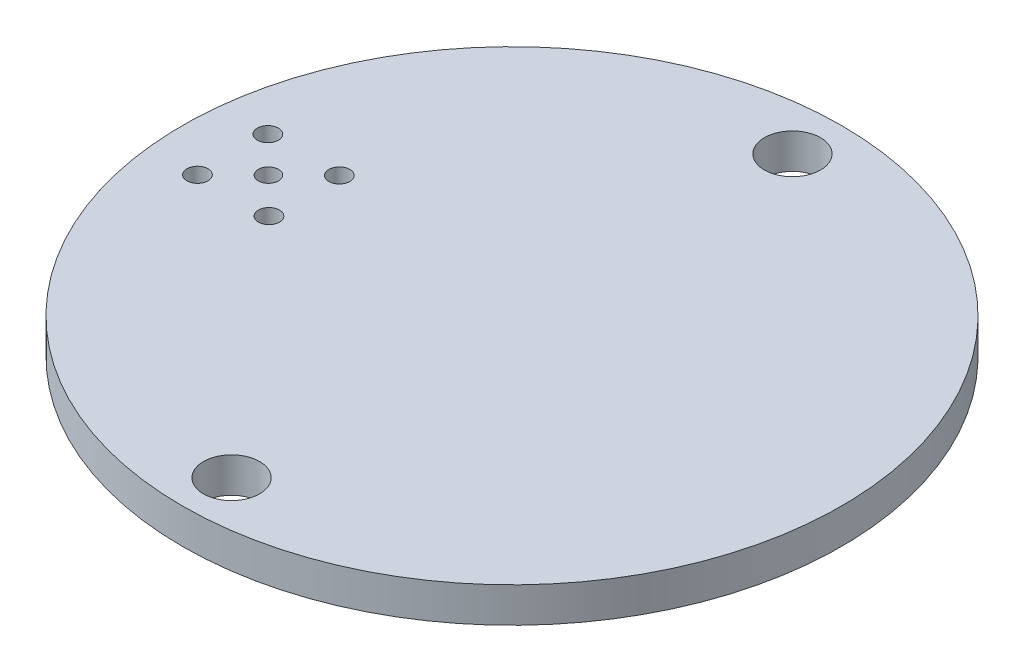
ISO-10303-21;
HEADER;
FILE_DESCRIPTION(('STEP AP214'),'2;1');
FILE_NAME('part.step','',(''),(''),'','','');
FILE_SCHEMA(('AUTOMOTIVE_DESIGN { 1 0 10303 214 1 1 1 1 }'));
ENDSEC;
DATA;
#1=APPLICATION_CONTEXT('core data for automotive mechanical design processes');
#2=APPLICATION_PROTOCOL_DEFINITION('international standard','automotive_design',2000,#1);
#3=PRODUCT_CONTEXT('',#1,'mechanical');
#4=PRODUCT('Part','Part','',(#3));
#5=PRODUCT_RELATED_PRODUCT_CATEGORY('part','',(#4));
#6=PRODUCT_DEFINITION_FORMATION('','',#4);
#7=PRODUCT_DEFINITION_CONTEXT('part definition',#1,'design');
#8=PRODUCT_DEFINITION('design','',#6,#7);
#9=PRODUCT_DEFINITION_SHAPE('','',#8);
#10=(LENGTH_UNIT() NAMED_UNIT(*) SI_UNIT(.MILLI.,.METRE.));
#11=(NAMED_UNIT(*) PLANE_ANGLE_UNIT() SI_UNIT($,.RADIAN.));
#12=(NAMED_UNIT(*) SI_UNIT($,.STERADIAN.) SOLID_ANGLE_UNIT());
#13=UNCERTAINTY_MEASURE_WITH_UNIT(LENGTH_MEASURE(1.E-05),#10,'distance_accuracy_value','');
#14=(GEOMETRIC_REPRESENTATION_CONTEXT(3) GLOBAL_UNCERTAINTY_ASSIGNED_CONTEXT((#13)) GLOBAL_UNIT_ASSIGNED_CONTEXT((#10,
#11,#12)) REPRESENTATION_CONTEXT('',''));
#15=CARTESIAN_POINT('',(0.,0.,0.));
#16=DIRECTION('',(0.,0.,1.));
#17=DIRECTION('',(1.,0.,0.));
#18=AXIS2_PLACEMENT_3D('',#15,#16,#17);
#19=CARTESIAN_POINT('',(0.,2.5,0.));
#20=DIRECTION('',(0.,1.,0.));
#21=DIRECTION('',(0.,0.,1.));
#22=AXIS2_PLACEMENT_3D('',#19,#20,#21);
#23=PLANE('',#22);
#24=CARTESIAN_POINT('',(-19.9202152137773,2.5,2.51));
#25=DIRECTION('',(0.,1.,0.));
#26=DIRECTION('',(0.,0.,-1.));
#27=AXIS2_PLACEMENT_3D('',#24,#25,#26);
#28=CIRCLE('',#27,0.750000000000002);
#29=CARTESIAN_POINT('',(-19.9202152137773,2.5,1.76));
#30=VERTEX_POINT('',#29);
#31=EDGE_CURVE('E75',#30,#30,#28,.T.);
#32=ORIENTED_EDGE('',*,*,#31,.F.);
#33=EDGE_LOOP('',(#32));
#34=FACE_BOUND('',#33,.T.);
#35=CARTESIAN_POINT('',(-14.8202152137773,2.5,-2.51));
#36=DIRECTION('',(0.,1.,0.));
#37=DIRECTION('',(0.,0.,1.));
#38=AXIS2_PLACEMENT_3D('',#35,#36,#37);
#39=CIRCLE('',#38,0.75);
#40=CARTESIAN_POINT('',(-14.8202152137773,2.5,-1.76));
#41=VERTEX_POINT('',#40);
#42=EDGE_CURVE('E63',#41,#41,#39,.T.);
#43=ORIENTED_EDGE('',*,*,#42,.F.);
#44=EDGE_LOOP('',(#43));
#45=FACE_BOUND('',#44,.T.);
#46=CARTESIAN_POINT('',(0.,2.5,-20.));
#47=DIRECTION('',(0.,1.,0.));
#48=DIRECTION('',(0.,0.,-1.));
#49=AXIS2_PLACEMENT_3D('',#46,#47,#48);
#50=CIRCLE('',#49,2.);
#51=CARTESIAN_POINT('',(0.,2.5,-22.));
#52=VERTEX_POINT('',#51);
#53=EDGE_CURVE('E51',#52,#52,#50,.T.);
#54=ORIENTED_EDGE('',*,*,#53,.F.);
#55=EDGE_LOOP('',(#54));
#56=FACE_BOUND('',#55,.T.);
#57=CARTESIAN_POINT('',(0.,2.5,0.));
#58=DIRECTION('',(0.,1.,0.));
#59=DIRECTION('',(0.,0.,1.));
#60=AXIS2_PLACEMENT_3D('',#57,#58,#59);
#61=CIRCLE('',#60,23.5);
#62=CARTESIAN_POINT('',(0.,2.5,23.5));
#63=VERTEX_POINT('',#62);
#64=EDGE_CURVE('E10',#63,#63,#61,.T.);
#65=ORIENTED_EDGE('',*,*,#64,.T.);
#66=EDGE_LOOP('',(#65));
#67=FACE_BOUND('',#66,.T.);
#68=CARTESIAN_POINT('',(0.,2.5,20.));
#69=DIRECTION('',(0.,1.,0.));
#70=DIRECTION('',(0.,0.,1.));
#71=AXIS2_PLACEMENT_3D('',#68,#69,#70);
#72=CIRCLE('',#71,2.);
#73=CARTESIAN_POINT('',(0.,2.5,22.));
#74=VERTEX_POINT('',#73);
#75=EDGE_CURVE('E46',#74,#74,#72,.T.);
#76=ORIENTED_EDGE('',*,*,#75,.F.);
#77=EDGE_LOOP('',(#76));
#78=FACE_BOUND('',#77,.T.);
#79=CARTESIAN_POINT('',(-19.9202152137773,2.5,-2.51));
#80=DIRECTION('',(0.,1.,0.));
#81=DIRECTION('',(0.,0.,1.));
#82=AXIS2_PLACEMENT_3D('',#79,#80,#81);
#83=CIRCLE('',#82,0.750000000000002);
#84=CARTESIAN_POINT('',(-19.9202152137773,2.5,-1.76));
#85=VERTEX_POINT('',#84);
#86=EDGE_CURVE('E57',#85,#85,#83,.T.);
#87=ORIENTED_EDGE('',*,*,#86,.F.);
#88=EDGE_LOOP('',(#87));
#89=FACE_BOUND('',#88,.T.);
#90=CARTESIAN_POINT('',(-14.8202152137773,2.5,2.51));
#91=DIRECTION('',(0.,1.,0.));
#92=DIRECTION('',(0.,0.,-1.));
#93=AXIS2_PLACEMENT_3D('',#90,#91,#92);
#94=CIRCLE('',#93,0.75);
#95=CARTESIAN_POINT('',(-14.8202152137773,2.5,1.76));
#96=VERTEX_POINT('',#95);
#97=EDGE_CURVE('E69',#96,#96,#94,.T.);
#98=ORIENTED_EDGE('',*,*,#97,.F.);
#99=EDGE_LOOP('',(#98));
#100=FACE_BOUND('',#99,.T.);
#101=CARTESIAN_POINT('',(-17.3702152137773,2.5,0.));
#102=DIRECTION('',(0.,1.,0.));
#103=DIRECTION('',(0.,0.,1.));
#104=AXIS2_PLACEMENT_3D('',#101,#102,#103);
#105=CIRCLE('',#104,0.718777800986236);
#106=CARTESIAN_POINT('',(-17.3702152137773,2.5,0.718777800986236));
#107=VERTEX_POINT('',#106);
#108=EDGE_CURVE('E81',#107,#107,#105,.T.);
#109=ORIENTED_EDGE('',*,*,#108,.F.);
#110=EDGE_LOOP('',(#109));
#111=FACE_BOUND('',#110,.T.);
#112=ADVANCED_FACE('F35',(#34,#45,#56,#67,#78,#89,#100,#111),#23,.T.);
#113=CARTESIAN_POINT('',(0.,0.,0.));
#114=DIRECTION('',(0.,1.,0.));
#115=DIRECTION('',(0.,0.,1.));
#116=AXIS2_PLACEMENT_3D('',#113,#114,#115);
#117=PLANE('',#116);
#118=CARTESIAN_POINT('',(0.,0.,0.));
#119=DIRECTION('',(0.,1.,0.));
#120=DIRECTION('',(0.,0.,1.));
#121=AXIS2_PLACEMENT_3D('',#118,#119,#120);
#122=CIRCLE('',#121,23.5);
#123=CARTESIAN_POINT('',(0.,0.,23.5));
#124=VERTEX_POINT('',#123);
#125=EDGE_CURVE('E39',#124,#124,#122,.T.);
#126=ORIENTED_EDGE('',*,*,#125,.F.);
#127=EDGE_LOOP('',(#126));
#128=FACE_BOUND('',#127,.T.);
#129=CARTESIAN_POINT('',(0.,0.,20.));
#130=DIRECTION('',(0.,1.,0.));
#131=DIRECTION('',(0.,0.,1.));
#132=AXIS2_PLACEMENT_3D('',#129,#130,#131);
#133=CIRCLE('',#132,2.);
#134=CARTESIAN_POINT('',(0.,0.,22.));
#135=VERTEX_POINT('',#134);
#136=EDGE_CURVE('E48',#135,#135,#133,.T.);
#137=ORIENTED_EDGE('',*,*,#136,.T.);
#138=EDGE_LOOP('',(#137));
#139=FACE_BOUND('',#138,.T.);
#140=CARTESIAN_POINT('',(0.,0.,-20.));
#141=DIRECTION('',(0.,1.,0.));
#142=DIRECTION('',(0.,0.,-1.));
#143=AXIS2_PLACEMENT_3D('',#140,#141,#142);
#144=CIRCLE('',#143,2.);
#145=CARTESIAN_POINT('',(0.,0.,-22.));
#146=VERTEX_POINT('',#145);
#147=EDGE_CURVE('E54',#146,#146,#144,.T.);
#148=ORIENTED_EDGE('',*,*,#147,.T.);
#149=EDGE_LOOP('',(#148));
#150=FACE_BOUND('',#149,.T.);
#151=CARTESIAN_POINT('',(-19.9202152137773,0.,-2.51));
#152=DIRECTION('',(0.,1.,0.));
#153=DIRECTION('',(0.,0.,1.));
#154=AXIS2_PLACEMENT_3D('',#151,#152,#153);
#155=CIRCLE('',#154,0.750000000000002);
#156=CARTESIAN_POINT('',(-19.9202152137773,0.,-1.76));
#157=VERTEX_POINT('',#156);
#158=EDGE_CURVE('E60',#157,#157,#155,.T.);
#159=ORIENTED_EDGE('',*,*,#158,.T.);
#160=EDGE_LOOP('',(#159));
#161=FACE_BOUND('',#160,.T.);
#162=CARTESIAN_POINT('',(-14.8202152137773,0.,-2.51));
#163=DIRECTION('',(0.,1.,0.));
#164=DIRECTION('',(0.,0.,1.));
#165=AXIS2_PLACEMENT_3D('',#162,#163,#164);
#166=CIRCLE('',#165,0.75);
#167=CARTESIAN_POINT('',(-14.8202152137773,0.,-1.76));
#168=VERTEX_POINT('',#167);
#169=EDGE_CURVE('E66',#168,#168,#166,.T.);
#170=ORIENTED_EDGE('',*,*,#169,.T.);
#171=EDGE_LOOP('',(#170));
#172=FACE_BOUND('',#171,.T.);
#173=CARTESIAN_POINT('',(-14.8202152137773,0.,2.51));
#174=DIRECTION('',(0.,1.,0.));
#175=DIRECTION('',(0.,0.,-1.));
#176=AXIS2_PLACEMENT_3D('',#173,#174,#175);
#177=CIRCLE('',#176,0.75);
#178=CARTESIAN_POINT('',(-14.8202152137773,0.,1.76));
#179=VERTEX_POINT('',#178);
#180=EDGE_CURVE('E72',#179,#179,#177,.T.);
#181=ORIENTED_EDGE('',*,*,#180,.T.);
#182=EDGE_LOOP('',(#181));
#183=FACE_BOUND('',#182,.T.);
#184=CARTESIAN_POINT('',(-19.9202152137773,0.,2.51));
#185=DIRECTION('',(0.,1.,0.));
#186=DIRECTION('',(0.,0.,-1.));
#187=AXIS2_PLACEMENT_3D('',#184,#185,#186);
#188=CIRCLE('',#187,0.750000000000002);
#189=CARTESIAN_POINT('',(-19.9202152137773,0.,1.76));
#190=VERTEX_POINT('',#189);
#191=EDGE_CURVE('E78',#190,#190,#188,.T.);
#192=ORIENTED_EDGE('',*,*,#191,.T.);
#193=EDGE_LOOP('',(#192));
#194=FACE_BOUND('',#193,.T.);
#195=CARTESIAN_POINT('',(-17.3702152137773,0.,0.));
#196=DIRECTION('',(0.,1.,0.));
#197=DIRECTION('',(0.,0.,1.));
#198=AXIS2_PLACEMENT_3D('',#195,#196,#197);
#199=CIRCLE('',#198,0.718777800986236);
#200=CARTESIAN_POINT('',(-17.3702152137773,0.,0.718777800986236));
#201=VERTEX_POINT('',#200);
#202=EDGE_CURVE('E84',#201,#201,#199,.T.);
#203=ORIENTED_EDGE('',*,*,#202,.T.);
#204=EDGE_LOOP('',(#203));
#205=FACE_BOUND('',#204,.T.);
#206=ADVANCED_FACE('F94',(#128,#139,#150,#161,#172,#183,#194,#205),#117,.F.);
#207=CARTESIAN_POINT('',(0.,2.5,0.));
#208=DIRECTION('',(0.,-1.,0.));
#209=DIRECTION('',(0.,0.,-1.));
#210=AXIS2_PLACEMENT_3D('',#207,#208,#209);
#211=CYLINDRICAL_SURFACE('',#210,23.5);
#212=ORIENTED_EDGE('',*,*,#64,.F.);
#213=EDGE_LOOP('',(#212));
#214=FACE_BOUND('',#213,.T.);
#215=ORIENTED_EDGE('',*,*,#125,.T.);
#216=EDGE_LOOP('',(#215));
#217=FACE_BOUND('',#216,.T.);
#218=ADVANCED_FACE('F37',(#214,#217),#211,.T.);
#219=CARTESIAN_POINT('',(0.,2.5,20.));
#220=DIRECTION('',(0.,-1.,0.));
#221=DIRECTION('',(0.,0.,-1.));
#222=AXIS2_PLACEMENT_3D('',#219,#220,#221);
#223=CYLINDRICAL_SURFACE('',#222,2.);
#224=ORIENTED_EDGE('',*,*,#75,.T.);
#225=EDGE_LOOP('',(#224));
#226=FACE_BOUND('',#225,.T.);
#227=ORIENTED_EDGE('',*,*,#136,.F.);
#228=EDGE_LOOP('',(#227));
#229=FACE_BOUND('',#228,.T.);
#230=ADVANCED_FACE('F104',(#226,#229),#223,.F.);
#231=CARTESIAN_POINT('',(0.,2.5,-20.));
#232=DIRECTION('',(0.,-1.,0.));
#233=DIRECTION('',(0.,0.,-1.));
#234=AXIS2_PLACEMENT_3D('',#231,#232,#233);
#235=CYLINDRICAL_SURFACE('',#234,2.);
#236=ORIENTED_EDGE('',*,*,#53,.T.);
#237=EDGE_LOOP('',(#236));
#238=FACE_BOUND('',#237,.T.);
#239=ORIENTED_EDGE('',*,*,#147,.F.);
#240=EDGE_LOOP('',(#239));
#241=FACE_BOUND('',#240,.T.);
#242=ADVANCED_FACE('F107',(#238,#241),#235,.F.);
#243=CARTESIAN_POINT('',(-19.9202152137773,2.5,-2.51));
#244=DIRECTION('',(0.,-1.,0.));
#245=DIRECTION('',(0.,0.,-1.));
#246=AXIS2_PLACEMENT_3D('',#243,#244,#245);
#247=CYLINDRICAL_SURFACE('',#246,0.750000000000002);
#248=ORIENTED_EDGE('',*,*,#86,.T.);
#249=EDGE_LOOP('',(#248));
#250=FACE_BOUND('',#249,.T.);
#251=ORIENTED_EDGE('',*,*,#158,.F.);
#252=EDGE_LOOP('',(#251));
#253=FACE_BOUND('',#252,.T.);
#254=ADVANCED_FACE('F111',(#250,#253),#247,.F.);
#255=CARTESIAN_POINT('',(-14.8202152137773,2.5,-2.51));
#256=DIRECTION('',(0.,-1.,0.));
#257=DIRECTION('',(0.,0.,-1.));
#258=AXIS2_PLACEMENT_3D('',#255,#256,#257);
#259=CYLINDRICAL_SURFACE('',#258,0.75);
#260=ORIENTED_EDGE('',*,*,#42,.T.);
#261=EDGE_LOOP('',(#260));
#262=FACE_BOUND('',#261,.T.);
#263=ORIENTED_EDGE('',*,*,#169,.F.);
#264=EDGE_LOOP('',(#263));
#265=FACE_BOUND('',#264,.T.);
#266=ADVANCED_FACE('F115',(#262,#265),#259,.F.);
#267=CARTESIAN_POINT('',(-14.8202152137773,2.5,2.51));
#268=DIRECTION('',(0.,-1.,0.));
#269=DIRECTION('',(0.,0.,-1.));
#270=AXIS2_PLACEMENT_3D('',#267,#268,#269);
#271=CYLINDRICAL_SURFACE('',#270,0.75);
#272=ORIENTED_EDGE('',*,*,#97,.T.);
#273=EDGE_LOOP('',(#272));
#274=FACE_BOUND('',#273,.T.);
#275=ORIENTED_EDGE('',*,*,#180,.F.);
#276=EDGE_LOOP('',(#275));
#277=FACE_BOUND('',#276,.T.);
#278=ADVANCED_FACE('F119',(#274,#277),#271,.F.);
#279=CARTESIAN_POINT('',(-19.9202152137773,2.5,2.51));
#280=DIRECTION('',(0.,-1.,0.));
#281=DIRECTION('',(0.,0.,-1.));
#282=AXIS2_PLACEMENT_3D('',#279,#280,#281);
#283=CYLINDRICAL_SURFACE('',#282,0.750000000000002);
#284=ORIENTED_EDGE('',*,*,#31,.T.);
#285=EDGE_LOOP('',(#284));
#286=FACE_BOUND('',#285,.T.);
#287=ORIENTED_EDGE('',*,*,#191,.F.);
#288=EDGE_LOOP('',(#287));
#289=FACE_BOUND('',#288,.T.);
#290=ADVANCED_FACE('F123',(#286,#289),#283,.F.);
#291=CARTESIAN_POINT('',(-17.3702152137773,2.5,0.));
#292=DIRECTION('',(0.,-1.,0.));
#293=DIRECTION('',(0.,0.,-1.));
#294=AXIS2_PLACEMENT_3D('',#291,#292,#293);
#295=CYLINDRICAL_SURFACE('',#294,0.718777800986236);
#296=ORIENTED_EDGE('',*,*,#108,.T.);
#297=EDGE_LOOP('',(#296));
#298=FACE_BOUND('',#297,.T.);
#299=ORIENTED_EDGE('',*,*,#202,.F.);
#300=EDGE_LOOP('',(#299));
#301=FACE_BOUND('',#300,.T.);
#302=ADVANCED_FACE('F90',(#298,#301),#295,.F.);
#303=CLOSED_SHELL('',(#112,#206,#218,#230,#242,#254,#266,#278,#290,#302));
#304=MANIFOLD_SOLID_BREP('B2',#303);
#305=ADVANCED_BREP_SHAPE_REPRESENTATION('',(#18,#304),#14);
#306=SHAPE_DEFINITION_REPRESENTATION(#9,#305);
ENDSEC;
END-ISO-10303-21;
